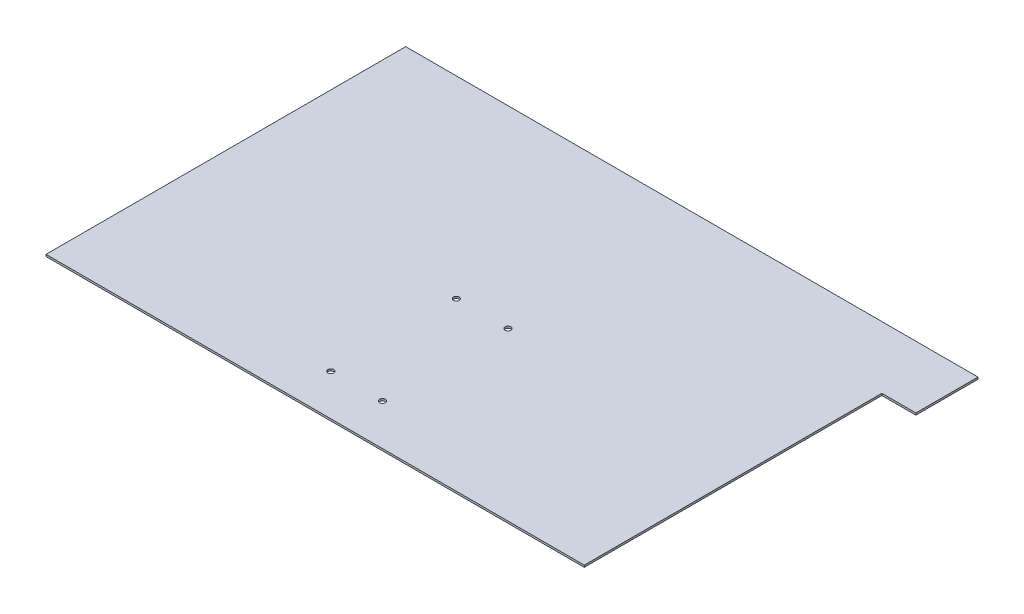
ISO-10303-21;
HEADER;
FILE_DESCRIPTION(('STEP AP214'),'2;1');
FILE_NAME('part.step','',(''),(''),'','','');
FILE_SCHEMA(('AUTOMOTIVE_DESIGN { 1 0 10303 214 1 1 1 1 }'));
ENDSEC;
DATA;
#1=APPLICATION_CONTEXT('core data for automotive mechanical design processes');
#2=APPLICATION_PROTOCOL_DEFINITION('international standard','automotive_design',2000,#1);
#3=PRODUCT_CONTEXT('',#1,'mechanical');
#4=PRODUCT('Part','Part','',(#3));
#5=PRODUCT_RELATED_PRODUCT_CATEGORY('part','',(#4));
#6=PRODUCT_DEFINITION_FORMATION('','',#4);
#7=PRODUCT_DEFINITION_CONTEXT('part definition',#1,'design');
#8=PRODUCT_DEFINITION('design','',#6,#7);
#9=PRODUCT_DEFINITION_SHAPE('','',#8);
#10=(LENGTH_UNIT() NAMED_UNIT(*) SI_UNIT(.MILLI.,.METRE.));
#11=(NAMED_UNIT(*) PLANE_ANGLE_UNIT() SI_UNIT($,.RADIAN.));
#12=(NAMED_UNIT(*) SI_UNIT($,.STERADIAN.) SOLID_ANGLE_UNIT());
#13=UNCERTAINTY_MEASURE_WITH_UNIT(LENGTH_MEASURE(1.E-05),#10,'distance_accuracy_value','');
#14=(GEOMETRIC_REPRESENTATION_CONTEXT(3) GLOBAL_UNCERTAINTY_ASSIGNED_CONTEXT((#13)) GLOBAL_UNIT_ASSIGNED_CONTEXT((#10,
#11,#12)) REPRESENTATION_CONTEXT('',''));
#15=CARTESIAN_POINT('',(0.,0.,0.));
#16=DIRECTION('',(0.,0.,1.));
#17=DIRECTION('',(1.,0.,0.));
#18=AXIS2_PLACEMENT_3D('',#15,#16,#17);
#19=CARTESIAN_POINT('',(411.5,-3.,-180.));
#20=DIRECTION('',(1.,0.,0.));
#21=DIRECTION('',(0.,0.,-1.));
#22=AXIS2_PLACEMENT_3D('',#19,#20,#21);
#23=PLANE('',#22);
#24=DIRECTION('',(0.,0.,-1.));
#25=VECTOR('',#24,1.);
#26=CARTESIAN_POINT('',(411.5,0.,-180.));
#27=LINE('',#26,#25);
#28=CARTESIAN_POINT('',(411.5,0.,275.));
#29=VERTEX_POINT('',#28);
#30=CARTESIAN_POINT('',(411.5,0.,-180.));
#31=VERTEX_POINT('',#30);
#32=EDGE_CURVE('E122',#29,#31,#27,.T.);
#33=ORIENTED_EDGE('',*,*,#32,.F.);
#34=DIRECTION('',(0.,1.,0.));
#35=VECTOR('',#34,1.);
#36=CARTESIAN_POINT('',(411.5,-3.,275.));
#37=LINE('',#36,#35);
#38=CARTESIAN_POINT('',(411.5,-3.,275.));
#39=VERTEX_POINT('',#38);
#40=EDGE_CURVE('E11',#39,#29,#37,.T.);
#41=ORIENTED_EDGE('',*,*,#40,.F.);
#42=DIRECTION('',(0.,0.,-1.));
#43=VECTOR('',#42,1.);
#44=CARTESIAN_POINT('',(411.5,-3.,-180.));
#45=LINE('',#44,#43);
#46=CARTESIAN_POINT('',(411.5,-3.,-180.));
#47=VERTEX_POINT('',#46);
#48=EDGE_CURVE('E137',#39,#47,#45,.T.);
#49=ORIENTED_EDGE('',*,*,#48,.T.);
#50=DIRECTION('',(0.,1.,0.));
#51=VECTOR('',#50,1.);
#52=CARTESIAN_POINT('',(411.5,-3.,-180.));
#53=LINE('',#52,#51);
#54=EDGE_CURVE('E42',#47,#31,#53,.T.);
#55=ORIENTED_EDGE('',*,*,#54,.T.);
#56=EDGE_LOOP('',(#33,#41,#49,#55));
#57=FACE_BOUND('',#56,.T.);
#58=ADVANCED_FACE('F39',(#57),#23,.T.);
#59=CARTESIAN_POINT('',(-411.5,-3.,275.));
#60=DIRECTION('',(0.,0.,1.));
#61=DIRECTION('',(1.,0.,0.));
#62=AXIS2_PLACEMENT_3D('',#59,#60,#61);
#63=PLANE('',#62);
#64=DIRECTION('',(1.,0.,0.));
#65=VECTOR('',#64,1.);
#66=CARTESIAN_POINT('',(-411.5,0.,275.));
#67=LINE('',#66,#65);
#68=CARTESIAN_POINT('',(-411.5,0.,275.));
#69=VERTEX_POINT('',#68);
#70=EDGE_CURVE('E135',#69,#29,#67,.T.);
#71=ORIENTED_EDGE('',*,*,#70,.F.);
#72=DIRECTION('',(0.,1.,0.));
#73=VECTOR('',#72,1.);
#74=CARTESIAN_POINT('',(-411.5,-3.,275.));
#75=LINE('',#74,#73);
#76=CARTESIAN_POINT('',(-411.5,-3.,275.));
#77=VERTEX_POINT('',#76);
#78=EDGE_CURVE('E48',#77,#69,#75,.T.);
#79=ORIENTED_EDGE('',*,*,#78,.F.);
#80=DIRECTION('',(1.,0.,0.));
#81=VECTOR('',#80,1.);
#82=CARTESIAN_POINT('',(-411.5,-3.,275.));
#83=LINE('',#82,#81);
#84=EDGE_CURVE('E117',#77,#39,#83,.T.);
#85=ORIENTED_EDGE('',*,*,#84,.T.);
#86=ORIENTED_EDGE('',*,*,#40,.T.);
#87=EDGE_LOOP('',(#71,#79,#85,#86));
#88=FACE_BOUND('',#87,.T.);
#89=ADVANCED_FACE('F145',(#88),#63,.T.);
#90=CARTESIAN_POINT('',(-411.5,-3.,-275.));
#91=DIRECTION('',(-1.,0.,0.));
#92=DIRECTION('',(0.,0.,1.));
#93=AXIS2_PLACEMENT_3D('',#90,#91,#92);
#94=PLANE('',#93);
#95=DIRECTION('',(0.,0.,1.));
#96=VECTOR('',#95,1.);
#97=CARTESIAN_POINT('',(-411.5,0.,-275.));
#98=LINE('',#97,#96);
#99=CARTESIAN_POINT('',(-411.5,0.,-275.));
#100=VERTEX_POINT('',#99);
#101=EDGE_CURVE('E113',#100,#69,#98,.T.);
#102=ORIENTED_EDGE('',*,*,#101,.F.);
#103=DIRECTION('',(0.,1.,0.));
#104=VECTOR('',#103,1.);
#105=CARTESIAN_POINT('',(-411.5,-3.,-275.));
#106=LINE('',#105,#104);
#107=CARTESIAN_POINT('',(-411.5,-3.,-275.));
#108=VERTEX_POINT('',#107);
#109=EDGE_CURVE('E101',#108,#100,#106,.T.);
#110=ORIENTED_EDGE('',*,*,#109,.F.);
#111=DIRECTION('',(0.,0.,1.));
#112=VECTOR('',#111,1.);
#113=CARTESIAN_POINT('',(-411.5,-3.,-275.));
#114=LINE('',#113,#112);
#115=EDGE_CURVE('E108',#108,#77,#114,.T.);
#116=ORIENTED_EDGE('',*,*,#115,.T.);
#117=ORIENTED_EDGE('',*,*,#78,.T.);
#118=EDGE_LOOP('',(#102,#110,#116,#117));
#119=FACE_BOUND('',#118,.T.);
#120=ADVANCED_FACE('F111',(#119),#94,.T.);
#121=CARTESIAN_POINT('',(-411.5,-3.,-275.));
#122=DIRECTION('',(0.,0.,-1.));
#123=DIRECTION('',(-1.,0.,0.));
#124=AXIS2_PLACEMENT_3D('',#121,#122,#123);
#125=PLANE('',#124);
#126=DIRECTION('',(-1.,0.,0.));
#127=VECTOR('',#126,1.);
#128=CARTESIAN_POINT('',(-411.5,0.,-275.));
#129=LINE('',#128,#127);
#130=CARTESIAN_POINT('',(463.5,0.,-275.));
#131=VERTEX_POINT('',#130);
#132=EDGE_CURVE('E132',#131,#100,#129,.T.);
#133=ORIENTED_EDGE('',*,*,#132,.F.);
#134=DIRECTION('',(0.,1.,0.));
#135=VECTOR('',#134,1.);
#136=CARTESIAN_POINT('',(463.5,-3.,-275.));
#137=LINE('',#136,#135);
#138=CARTESIAN_POINT('',(463.5,-3.,-275.));
#139=VERTEX_POINT('',#138);
#140=EDGE_CURVE('E103',#139,#131,#137,.T.);
#141=ORIENTED_EDGE('',*,*,#140,.F.);
#142=DIRECTION('',(-1.,0.,0.));
#143=VECTOR('',#142,1.);
#144=CARTESIAN_POINT('',(411.5,-3.,-275.));
#145=LINE('',#144,#143);
#146=EDGE_CURVE('E98',#139,#108,#145,.T.);
#147=ORIENTED_EDGE('',*,*,#146,.T.);
#148=ORIENTED_EDGE('',*,*,#109,.T.);
#149=EDGE_LOOP('',(#133,#141,#147,#148));
#150=FACE_BOUND('',#149,.T.);
#151=ADVANCED_FACE('F100',(#150),#125,.T.);
#152=CARTESIAN_POINT('',(463.5,-3.,-275.));
#153=DIRECTION('',(1.,0.,0.));
#154=DIRECTION('',(0.,0.,-1.));
#155=AXIS2_PLACEMENT_3D('',#152,#153,#154);
#156=PLANE('',#155);
#157=DIRECTION('',(0.,0.,-1.));
#158=VECTOR('',#157,1.);
#159=CARTESIAN_POINT('',(463.5,0.,-275.));
#160=LINE('',#159,#158);
#161=CARTESIAN_POINT('',(463.5,0.,-180.));
#162=VERTEX_POINT('',#161);
#163=EDGE_CURVE('E129',#162,#131,#160,.T.);
#164=ORIENTED_EDGE('',*,*,#163,.F.);
#165=DIRECTION('',(0.,1.,0.));
#166=VECTOR('',#165,1.);
#167=CARTESIAN_POINT('',(463.5,-3.,-180.));
#168=LINE('',#167,#166);
#169=CARTESIAN_POINT('',(463.5,-3.,-180.));
#170=VERTEX_POINT('',#169);
#171=EDGE_CURVE('E140',#170,#162,#168,.T.);
#172=ORIENTED_EDGE('',*,*,#171,.F.);
#173=DIRECTION('',(0.,0.,-1.));
#174=VECTOR('',#173,1.);
#175=CARTESIAN_POINT('',(463.5,-3.,-275.));
#176=LINE('',#175,#174);
#177=EDGE_CURVE('E109',#170,#139,#176,.T.);
#178=ORIENTED_EDGE('',*,*,#177,.T.);
#179=ORIENTED_EDGE('',*,*,#140,.T.);
#180=EDGE_LOOP('',(#164,#172,#178,#179));
#181=FACE_BOUND('',#180,.T.);
#182=ADVANCED_FACE('F158',(#181),#156,.T.);
#183=CARTESIAN_POINT('',(463.5,-3.,-180.));
#184=DIRECTION('',(0.,0.,1.));
#185=DIRECTION('',(1.,0.,0.));
#186=AXIS2_PLACEMENT_3D('',#183,#184,#185);
#187=PLANE('',#186);
#188=DIRECTION('',(1.,0.,0.));
#189=VECTOR('',#188,1.);
#190=CARTESIAN_POINT('',(463.5,0.,-180.));
#191=LINE('',#190,#189);
#192=EDGE_CURVE('E125',#31,#162,#191,.T.);
#193=ORIENTED_EDGE('',*,*,#192,.F.);
#194=ORIENTED_EDGE('',*,*,#54,.F.);
#195=DIRECTION('',(1.,0.,0.));
#196=VECTOR('',#195,1.);
#197=CARTESIAN_POINT('',(463.5,-3.,-180.));
#198=LINE('',#197,#196);
#199=EDGE_CURVE('E217',#47,#170,#198,.T.);
#200=ORIENTED_EDGE('',*,*,#199,.T.);
#201=ORIENTED_EDGE('',*,*,#171,.T.);
#202=EDGE_LOOP('',(#193,#194,#200,#201));
#203=FACE_BOUND('',#202,.T.);
#204=ADVANCED_FACE('F142',(#203),#187,.T.);
#205=CARTESIAN_POINT('',(0.,-3.,0.));
#206=DIRECTION('',(0.,1.,0.));
#207=DIRECTION('',(0.,0.,1.));
#208=AXIS2_PLACEMENT_3D('',#205,#206,#207);
#209=PLANE('',#208);
#210=CARTESIAN_POINT('',(40.0000000000003,-3.,19.9999999999999));
#211=DIRECTION('',(0.,1.,0.));
#212=DIRECTION('',(0.,0.,-1.));
#213=AXIS2_PLACEMENT_3D('',#210,#211,#212);
#214=CIRCLE('',#213,4.5);
#215=CARTESIAN_POINT('',(40.0000000000003,-3.,15.4999999999999));
#216=VERTEX_POINT('',#215);
#217=EDGE_CURVE('E192',#216,#216,#214,.T.);
#218=ORIENTED_EDGE('',*,*,#217,.T.);
#219=EDGE_LOOP('',(#218));
#220=FACE_BOUND('',#219,.T.);
#221=CARTESIAN_POINT('',(-38.9999999999997,-3.,19.9999999999999));
#222=DIRECTION('',(0.,1.,0.));
#223=DIRECTION('',(0.,0.,1.));
#224=AXIS2_PLACEMENT_3D('',#221,#222,#223);
#225=CIRCLE('',#224,4.5);
#226=CARTESIAN_POINT('',(-38.9999999999997,-3.,24.4999999999998));
#227=VERTEX_POINT('',#226);
#228=EDGE_CURVE('E200',#227,#227,#225,.T.);
#229=ORIENTED_EDGE('',*,*,#228,.T.);
#230=EDGE_LOOP('',(#229));
#231=FACE_BOUND('',#230,.T.);
#232=CARTESIAN_POINT('',(40.0000000000003,-3.,212.));
#233=DIRECTION('',(0.,1.,0.));
#234=DIRECTION('',(0.,0.,1.));
#235=AXIS2_PLACEMENT_3D('',#232,#233,#234);
#236=CIRCLE('',#235,4.5);
#237=CARTESIAN_POINT('',(40.0000000000003,-3.,216.5));
#238=VERTEX_POINT('',#237);
#239=EDGE_CURVE('E206',#238,#238,#236,.T.);
#240=ORIENTED_EDGE('',*,*,#239,.T.);
#241=EDGE_LOOP('',(#240));
#242=FACE_BOUND('',#241,.T.);
#243=CARTESIAN_POINT('',(-38.9999999999997,-3.,212.));
#244=DIRECTION('',(0.,1.,0.));
#245=DIRECTION('',(0.,0.,-1.));
#246=AXIS2_PLACEMENT_3D('',#243,#244,#245);
#247=CIRCLE('',#246,4.5);
#248=CARTESIAN_POINT('',(-38.9999999999997,-3.,207.5));
#249=VERTEX_POINT('',#248);
#250=EDGE_CURVE('E126',#249,#249,#247,.T.);
#251=ORIENTED_EDGE('',*,*,#250,.T.);
#252=EDGE_LOOP('',(#251));
#253=FACE_BOUND('',#252,.T.);
#254=ORIENTED_EDGE('',*,*,#48,.F.);
#255=ORIENTED_EDGE('',*,*,#84,.F.);
#256=ORIENTED_EDGE('',*,*,#115,.F.);
#257=ORIENTED_EDGE('',*,*,#146,.F.);
#258=ORIENTED_EDGE('',*,*,#177,.F.);
#259=ORIENTED_EDGE('',*,*,#199,.F.);
#260=EDGE_LOOP('',(#254,#255,#256,#257,#258,#259));
#261=FACE_BOUND('',#260,.T.);
#262=ADVANCED_FACE('F116',(#220,#231,#242,#253,#261),#209,.F.);
#263=CARTESIAN_POINT('',(0.,0.,0.));
#264=DIRECTION('',(0.,1.,0.));
#265=DIRECTION('',(0.,0.,1.));
#266=AXIS2_PLACEMENT_3D('',#263,#264,#265);
#267=PLANE('',#266);
#268=CARTESIAN_POINT('',(40.0000000000003,0.,19.9999999999999));
#269=DIRECTION('',(0.,1.,0.));
#270=DIRECTION('',(0.,0.,-1.));
#271=AXIS2_PLACEMENT_3D('',#268,#269,#270);
#272=CIRCLE('',#271,4.5);
#273=CARTESIAN_POINT('',(40.0000000000003,0.,15.4999999999999));
#274=VERTEX_POINT('',#273);
#275=EDGE_CURVE('E195',#274,#274,#272,.T.);
#276=ORIENTED_EDGE('',*,*,#275,.F.);
#277=EDGE_LOOP('',(#276));
#278=FACE_BOUND('',#277,.T.);
#279=CARTESIAN_POINT('',(-38.9999999999997,0.,19.9999999999999));
#280=DIRECTION('',(0.,1.,0.));
#281=DIRECTION('',(0.,0.,1.));
#282=AXIS2_PLACEMENT_3D('',#279,#280,#281);
#283=CIRCLE('',#282,4.5);
#284=CARTESIAN_POINT('',(-38.9999999999997,0.,24.4999999999998));
#285=VERTEX_POINT('',#284);
#286=EDGE_CURVE('E197',#285,#285,#283,.T.);
#287=ORIENTED_EDGE('',*,*,#286,.F.);
#288=EDGE_LOOP('',(#287));
#289=FACE_BOUND('',#288,.T.);
#290=CARTESIAN_POINT('',(40.0000000000003,0.,212.));
#291=DIRECTION('',(0.,1.,0.));
#292=DIRECTION('',(0.,0.,1.));
#293=AXIS2_PLACEMENT_3D('',#290,#291,#292);
#294=CIRCLE('',#293,4.5);
#295=CARTESIAN_POINT('',(40.0000000000003,0.,216.5));
#296=VERTEX_POINT('',#295);
#297=EDGE_CURVE('E203',#296,#296,#294,.T.);
#298=ORIENTED_EDGE('',*,*,#297,.F.);
#299=EDGE_LOOP('',(#298));
#300=FACE_BOUND('',#299,.T.);
#301=CARTESIAN_POINT('',(-38.9999999999997,0.,212.));
#302=DIRECTION('',(0.,1.,0.));
#303=DIRECTION('',(0.,0.,-1.));
#304=AXIS2_PLACEMENT_3D('',#301,#302,#303);
#305=CIRCLE('',#304,4.5);
#306=CARTESIAN_POINT('',(-38.9999999999997,0.,207.5));
#307=VERTEX_POINT('',#306);
#308=EDGE_CURVE('E209',#307,#307,#305,.T.);
#309=ORIENTED_EDGE('',*,*,#308,.F.);
#310=EDGE_LOOP('',(#309));
#311=FACE_BOUND('',#310,.T.);
#312=ORIENTED_EDGE('',*,*,#32,.T.);
#313=ORIENTED_EDGE('',*,*,#192,.T.);
#314=ORIENTED_EDGE('',*,*,#163,.T.);
#315=ORIENTED_EDGE('',*,*,#132,.T.);
#316=ORIENTED_EDGE('',*,*,#101,.T.);
#317=ORIENTED_EDGE('',*,*,#70,.T.);
#318=EDGE_LOOP('',(#312,#313,#314,#315,#316,#317));
#319=FACE_BOUND('',#318,.T.);
#320=ADVANCED_FACE('F144',(#278,#289,#300,#311,#319),#267,.T.);
#321=CARTESIAN_POINT('',(-38.9999999999997,-3.,212.));
#322=DIRECTION('',(0.,1.,0.));
#323=DIRECTION('',(0.,0.,1.));
#324=AXIS2_PLACEMENT_3D('',#321,#322,#323);
#325=CYLINDRICAL_SURFACE('',#324,4.5);
#326=ORIENTED_EDGE('',*,*,#250,.F.);
#327=EDGE_LOOP('',(#326));
#328=FACE_BOUND('',#327,.T.);
#329=ORIENTED_EDGE('',*,*,#308,.T.);
#330=EDGE_LOOP('',(#329));
#331=FACE_BOUND('',#330,.T.);
#332=ADVANCED_FACE('F169',(#328,#331),#325,.F.);
#333=CARTESIAN_POINT('',(40.0000000000003,-3.,212.));
#334=DIRECTION('',(0.,1.,0.));
#335=DIRECTION('',(0.,0.,1.));
#336=AXIS2_PLACEMENT_3D('',#333,#334,#335);
#337=CYLINDRICAL_SURFACE('',#336,4.5);
#338=ORIENTED_EDGE('',*,*,#239,.F.);
#339=EDGE_LOOP('',(#338));
#340=FACE_BOUND('',#339,.T.);
#341=ORIENTED_EDGE('',*,*,#297,.T.);
#342=EDGE_LOOP('',(#341));
#343=FACE_BOUND('',#342,.T.);
#344=ADVANCED_FACE('F176',(#340,#343),#337,.F.);
#345=CARTESIAN_POINT('',(-38.9999999999997,-3.,19.9999999999999));
#346=DIRECTION('',(0.,1.,0.));
#347=DIRECTION('',(0.,0.,1.));
#348=AXIS2_PLACEMENT_3D('',#345,#346,#347);
#349=CYLINDRICAL_SURFACE('',#348,4.5);
#350=ORIENTED_EDGE('',*,*,#228,.F.);
#351=EDGE_LOOP('',(#350));
#352=FACE_BOUND('',#351,.T.);
#353=ORIENTED_EDGE('',*,*,#286,.T.);
#354=EDGE_LOOP('',(#353));
#355=FACE_BOUND('',#354,.T.);
#356=ADVANCED_FACE('F180',(#352,#355),#349,.F.);
#357=CARTESIAN_POINT('',(40.0000000000003,-3.,19.9999999999999));
#358=DIRECTION('',(0.,1.,0.));
#359=DIRECTION('',(0.,0.,1.));
#360=AXIS2_PLACEMENT_3D('',#357,#358,#359);
#361=CYLINDRICAL_SURFACE('',#360,4.5);
#362=ORIENTED_EDGE('',*,*,#217,.F.);
#363=EDGE_LOOP('',(#362));
#364=FACE_BOUND('',#363,.T.);
#365=ORIENTED_EDGE('',*,*,#275,.T.);
#366=EDGE_LOOP('',(#365));
#367=FACE_BOUND('',#366,.T.);
#368=ADVANCED_FACE('F184',(#364,#367),#361,.F.);
#369=CLOSED_SHELL('',(#58,#89,#120,#151,#182,#204,#262,#320,#332,#344,#356,#368));
#370=MANIFOLD_SOLID_BREP('B2',#369);
#371=ADVANCED_BREP_SHAPE_REPRESENTATION('',(#18,#370),#14);
#372=SHAPE_DEFINITION_REPRESENTATION(#9,#371);
ENDSEC;
END-ISO-10303-21;
